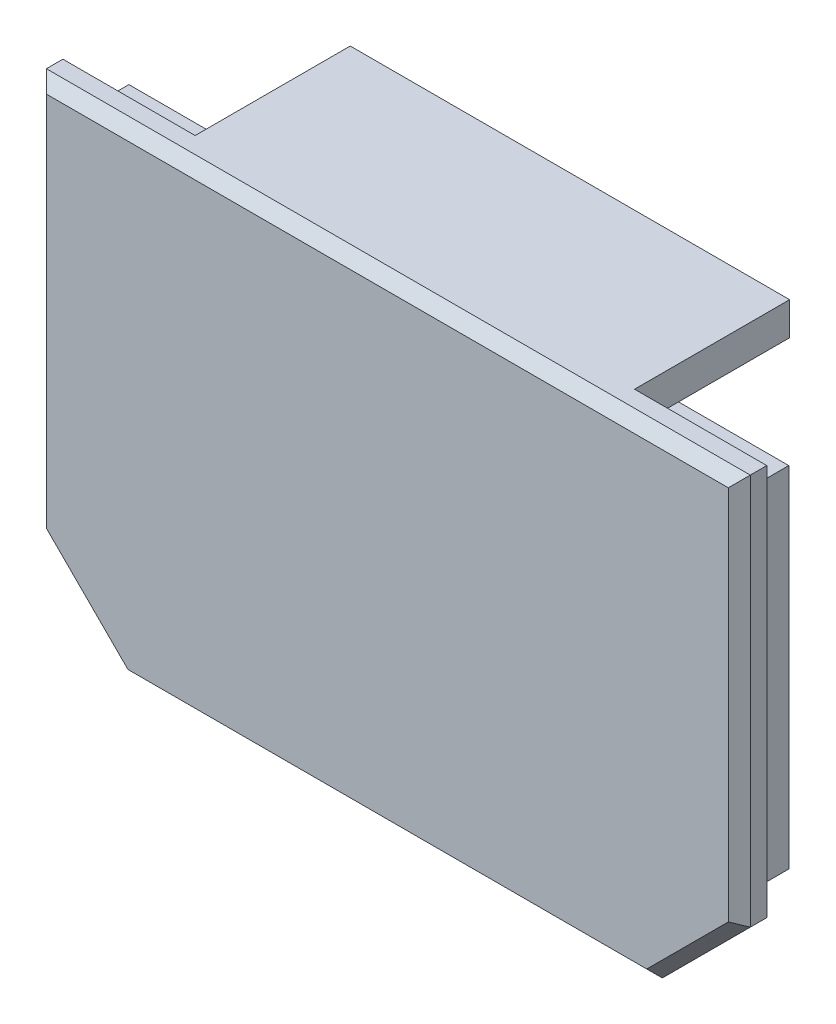
ISO-10303-21;
HEADER;
FILE_DESCRIPTION(('STEP AP214'),'2;1');
FILE_NAME('part.step','',(''),(''),'','','');
FILE_SCHEMA(('AUTOMOTIVE_DESIGN { 1 0 10303 214 1 1 1 1 }'));
ENDSEC;
DATA;
#1=APPLICATION_CONTEXT('core data for automotive mechanical design processes');
#2=APPLICATION_PROTOCOL_DEFINITION('international standard','automotive_design',2000,#1);
#3=PRODUCT_CONTEXT('',#1,'mechanical');
#4=PRODUCT('Part','Part','',(#3));
#5=PRODUCT_RELATED_PRODUCT_CATEGORY('part','',(#4));
#6=PRODUCT_DEFINITION_FORMATION('','',#4);
#7=PRODUCT_DEFINITION_CONTEXT('part definition',#1,'design');
#8=PRODUCT_DEFINITION('design','',#6,#7);
#9=PRODUCT_DEFINITION_SHAPE('','',#8);
#10=(LENGTH_UNIT() NAMED_UNIT(*) SI_UNIT(.MILLI.,.METRE.));
#11=(NAMED_UNIT(*) PLANE_ANGLE_UNIT() SI_UNIT($,.RADIAN.));
#12=(NAMED_UNIT(*) SI_UNIT($,.STERADIAN.) SOLID_ANGLE_UNIT());
#13=UNCERTAINTY_MEASURE_WITH_UNIT(LENGTH_MEASURE(1.E-05),#10,'distance_accuracy_value','');
#14=(GEOMETRIC_REPRESENTATION_CONTEXT(3) GLOBAL_UNCERTAINTY_ASSIGNED_CONTEXT((#13)) GLOBAL_UNIT_ASSIGNED_CONTEXT((#10,
#11,#12)) REPRESENTATION_CONTEXT('',''));
#15=CARTESIAN_POINT('',(0.,0.,0.));
#16=DIRECTION('',(0.,0.,1.));
#17=DIRECTION('',(1.,0.,0.));
#18=AXIS2_PLACEMENT_3D('',#15,#16,#17);
#19=CARTESIAN_POINT('',(-29.9999,-3.0001,-4.));
#20=DIRECTION('',(0.,1.,0.));
#21=DIRECTION('',(0.,0.,1.));
#22=AXIS2_PLACEMENT_3D('',#19,#20,#21);
#23=PLANE('',#22);
#24=DIRECTION('',(-1.,0.,0.));
#25=VECTOR('',#24,1.);
#26=CARTESIAN_POINT('',(-29.9999,-3.0001,-4.));
#27=LINE('',#26,#25);
#28=CARTESIAN_POINT('',(29.9999000000061,-3.0001,-4.));
#29=VERTEX_POINT('',#28);
#30=CARTESIAN_POINT('',(19.9750000000061,-3.0001,-4.));
#31=VERTEX_POINT('',#30);
#32=EDGE_CURVE('E389',#29,#31,#27,.T.);
#33=ORIENTED_EDGE('',*,*,#32,.T.);
#34=DIRECTION('',(0.,0.,1.));
#35=VECTOR('',#34,1.);
#36=CARTESIAN_POINT('',(19.9750000000061,-3.0001,-14.1));
#37=LINE('',#36,#35);
#38=CARTESIAN_POINT('',(19.9750000000061,-3.0001,0.));
#39=VERTEX_POINT('',#38);
#40=EDGE_CURVE('E271',#31,#39,#37,.T.);
#41=ORIENTED_EDGE('',*,*,#40,.T.);
#42=DIRECTION('',(-1.,0.,0.));
#43=VECTOR('',#42,1.);
#44=CARTESIAN_POINT('',(-29.9999,-3.0001,0.));
#45=LINE('',#44,#43);
#46=CARTESIAN_POINT('',(29.9999000000061,-3.0001,0.));
#47=VERTEX_POINT('',#46);
#48=EDGE_CURVE('E376',#47,#39,#45,.T.);
#49=ORIENTED_EDGE('',*,*,#48,.F.);
#50=DIRECTION('',(0.,0.,1.));
#51=VECTOR('',#50,1.);
#52=CARTESIAN_POINT('',(29.9999000000061,-3.0001,-4.));
#53=LINE('',#52,#51);
#54=EDGE_CURVE('E412',#29,#47,#53,.T.);
#55=ORIENTED_EDGE('',*,*,#54,.F.);
#56=EDGE_LOOP('',(#33,#41,#49,#55));
#57=FACE_BOUND('',#56,.T.);
#58=ADVANCED_FACE('F43',(#57),#23,.T.);
#59=CARTESIAN_POINT('',(-19.975,-3.0001,0.));
#60=VERTEX_POINT('',#59);
#61=CARTESIAN_POINT('',(-29.9999,-3.0001,0.));
#62=VERTEX_POINT('',#61);
#63=EDGE_CURVE('E405',#60,#62,#45,.T.);
#64=ORIENTED_EDGE('',*,*,#63,.F.);
#65=DIRECTION('',(0.,0.,1.));
#66=VECTOR('',#65,1.);
#67=CARTESIAN_POINT('',(-19.975,-3.0001,-14.1));
#68=LINE('',#67,#66);
#69=CARTESIAN_POINT('',(-19.975,-3.0001,-4.));
#70=VERTEX_POINT('',#69);
#71=EDGE_CURVE('E722',#70,#60,#68,.T.);
#72=ORIENTED_EDGE('',*,*,#71,.F.);
#73=CARTESIAN_POINT('',(-29.9999,-3.0001,-4.));
#74=VERTEX_POINT('',#73);
#75=EDGE_CURVE('E388',#70,#74,#27,.T.);
#76=ORIENTED_EDGE('',*,*,#75,.T.);
#77=DIRECTION('',(0.,0.,1.));
#78=VECTOR('',#77,1.);
#79=CARTESIAN_POINT('',(-29.9999,-3.0001,-4.));
#80=LINE('',#79,#78);
#81=EDGE_CURVE('E408',#74,#62,#80,.T.);
#82=ORIENTED_EDGE('',*,*,#81,.T.);
#83=EDGE_LOOP('',(#64,#72,#76,#82));
#84=FACE_BOUND('',#83,.T.);
#85=ADVANCED_FACE('F557',(#84),#23,.T.);
#86=CARTESIAN_POINT('',(0.,0.,0.));
#87=DIRECTION('',(0.,0.,-1.));
#88=DIRECTION('',(-1.,0.,0.));
#89=AXIS2_PLACEMENT_3D('',#86,#87,#88);
#90=PLANE('',#89);
#91=ORIENTED_EDGE('',*,*,#48,.T.);
#92=DIRECTION('',(0.,-1.,0.));
#93=VECTOR('',#92,1.);
#94=CARTESIAN_POINT('',(19.9750000000061,4.55020154334958E-12,0.));
#95=LINE('',#94,#93);
#96=CARTESIAN_POINT('',(19.9750000000061,4.55020154334958E-12,0.));
#97=VERTEX_POINT('',#96);
#98=EDGE_CURVE('E724',#97,#39,#95,.T.);
#99=ORIENTED_EDGE('',*,*,#98,.F.);
#100=DIRECTION('',(-1.,0.,0.));
#101=VECTOR('',#100,1.);
#102=CARTESIAN_POINT('',(-32.,0.,0.));
#103=LINE('',#102,#101);
#104=CARTESIAN_POINT('',(32.0000000000054,4.55020154334958E-12,0.));
#105=VERTEX_POINT('',#104);
#106=EDGE_CURVE('E300',#105,#97,#103,.T.);
#107=ORIENTED_EDGE('',*,*,#106,.F.);
#108=DIRECTION('',(0.,1.,0.));
#109=VECTOR('',#108,1.);
#110=CARTESIAN_POINT('',(32.0000000000054,4.55020154334958E-12,0.));
#111=LINE('',#110,#109);
#112=CARTESIAN_POINT('',(32.0000000000054,-35.6000000000053,0.));
#113=VERTEX_POINT('',#112);
#114=EDGE_CURVE('E296',#113,#105,#111,.T.);
#115=ORIENTED_EDGE('',*,*,#114,.F.);
#116=DIRECTION('',(0.707106781186548,0.707106781186547,0.));
#117=VECTOR('',#116,1.);
#118=CARTESIAN_POINT('',(32.0000000000054,-35.6000000000053,0.));
#119=LINE('',#118,#117);
#120=CARTESIAN_POINT('',(24.0000000000107,-43.6,0.));
#121=VERTEX_POINT('',#120);
#122=EDGE_CURVE('E293',#121,#113,#119,.T.);
#123=ORIENTED_EDGE('',*,*,#122,.F.);
#124=DIRECTION('',(1.,0.,0.));
#125=VECTOR('',#124,1.);
#126=CARTESIAN_POINT('',(24.0000000000107,-43.6,0.));
#127=LINE('',#126,#125);
#128=CARTESIAN_POINT('',(2.74999999999999,-43.6,0.));
#129=VERTEX_POINT('',#128);
#130=EDGE_CURVE('E291',#129,#121,#127,.T.);
#131=ORIENTED_EDGE('',*,*,#130,.F.);
#132=DIRECTION('',(0.,-1.,0.));
#133=VECTOR('',#132,1.);
#134=CARTESIAN_POINT('',(2.74999999999999,-35.4152415615735,0.));
#135=LINE('',#134,#133);
#136=CARTESIAN_POINT('',(2.74999999999999,-41.5999,0.));
#137=VERTEX_POINT('',#136);
#138=EDGE_CURVE('E474',#129,#137,#135,.F.);
#139=ORIENTED_EDGE('',*,*,#138,.T.);
#140=DIRECTION('',(1.,0.,0.));
#141=VECTOR('',#140,1.);
#142=CARTESIAN_POINT('',(23.171531453909,-41.5999,0.));
#143=LINE('',#142,#141);
#144=CARTESIAN_POINT('',(23.171531453909,-41.5999,0.));
#145=VERTEX_POINT('',#144);
#146=EDGE_CURVE('E397',#137,#145,#143,.T.);
#147=ORIENTED_EDGE('',*,*,#146,.T.);
#148=DIRECTION('',(0.707106781186547,0.707106781186548,0.));
#149=VECTOR('',#148,1.);
#150=CARTESIAN_POINT('',(29.9999000000061,-34.7715314539029,0.));
#151=LINE('',#150,#149);
#152=CARTESIAN_POINT('',(29.9999000000061,-34.7715314539029,0.));
#153=VERTEX_POINT('',#152);
#154=EDGE_CURVE('E399',#145,#153,#151,.T.);
#155=ORIENTED_EDGE('',*,*,#154,.T.);
#156=DIRECTION('',(0.,1.,0.));
#157=VECTOR('',#156,1.);
#158=CARTESIAN_POINT('',(29.9999000000061,-3.0001,0.));
#159=LINE('',#158,#157);
#160=EDGE_CURVE('E402',#153,#47,#159,.T.);
#161=ORIENTED_EDGE('',*,*,#160,.T.);
#162=EDGE_LOOP('',(#91,#99,#107,#115,#123,#131,#139,#147,#155,#161));
#163=FACE_BOUND('',#162,.T.);
#164=ADVANCED_FACE('F502',(#163),#90,.T.);
#165=CARTESIAN_POINT('',(-19.975,8.54940211855845E-13,0.));
#166=VERTEX_POINT('',#165);
#167=CARTESIAN_POINT('',(-32.,0.,0.));
#168=VERTEX_POINT('',#167);
#169=EDGE_CURVE('E299',#166,#168,#103,.T.);
#170=ORIENTED_EDGE('',*,*,#169,.F.);
#171=DIRECTION('',(0.,1.,0.));
#172=VECTOR('',#171,1.);
#173=CARTESIAN_POINT('',(-19.975,4.55020154334958E-12,0.));
#174=LINE('',#173,#172);
#175=EDGE_CURVE('E267',#60,#166,#174,.T.);
#176=ORIENTED_EDGE('',*,*,#175,.F.);
#177=ORIENTED_EDGE('',*,*,#63,.T.);
#178=DIRECTION('',(0.,-1.,0.));
#179=VECTOR('',#178,1.);
#180=CARTESIAN_POINT('',(-29.9999,-34.7715314538976,0.));
#181=LINE('',#180,#179);
#182=CARTESIAN_POINT('',(-29.9999,-34.7715314538976,0.));
#183=VERTEX_POINT('',#182);
#184=EDGE_CURVE('E357',#62,#183,#181,.T.);
#185=ORIENTED_EDGE('',*,*,#184,.T.);
#186=DIRECTION('',(0.707106781186548,-0.707106781186547,0.));
#187=VECTOR('',#186,1.);
#188=CARTESIAN_POINT('',(-23.1715314538976,-41.5999,0.));
#189=LINE('',#188,#187);
#190=CARTESIAN_POINT('',(-23.1715314538976,-41.5999,0.));
#191=VERTEX_POINT('',#190);
#192=EDGE_CURVE('E395',#183,#191,#189,.T.);
#193=ORIENTED_EDGE('',*,*,#192,.T.);
#194=CARTESIAN_POINT('',(-2.74999999999998,-41.5999,0.));
#195=VERTEX_POINT('',#194);
#196=EDGE_CURVE('E80',#191,#195,#143,.T.);
#197=ORIENTED_EDGE('',*,*,#196,.T.);
#198=DIRECTION('',(0.,1.,0.));
#199=VECTOR('',#198,1.);
#200=CARTESIAN_POINT('',(-2.74999999999998,-35.4152415615735,0.));
#201=LINE('',#200,#199);
#202=CARTESIAN_POINT('',(-2.74999999999998,-43.6,0.));
#203=VERTEX_POINT('',#202);
#204=EDGE_CURVE('E52',#195,#203,#201,.F.);
#205=ORIENTED_EDGE('',*,*,#204,.T.);
#206=CARTESIAN_POINT('',(-24.,-43.6,0.));
#207=VERTEX_POINT('',#206);
#208=EDGE_CURVE('E67',#207,#203,#127,.T.);
#209=ORIENTED_EDGE('',*,*,#208,.F.);
#210=DIRECTION('',(0.707106781186549,-0.707106781186547,0.));
#211=VECTOR('',#210,1.);
#212=CARTESIAN_POINT('',(-24.,-43.6,0.));
#213=LINE('',#212,#211);
#214=CARTESIAN_POINT('',(-32.,-35.6,0.));
#215=VERTEX_POINT('',#214);
#216=EDGE_CURVE('E287',#215,#207,#213,.T.);
#217=ORIENTED_EDGE('',*,*,#216,.F.);
#218=DIRECTION('',(0.,-1.,0.));
#219=VECTOR('',#218,1.);
#220=CARTESIAN_POINT('',(-32.,-35.6,0.));
#221=LINE('',#220,#219);
#222=EDGE_CURVE('E284',#168,#215,#221,.T.);
#223=ORIENTED_EDGE('',*,*,#222,.F.);
#224=EDGE_LOOP('',(#170,#176,#177,#185,#193,#197,#205,#209,#217,#223));
#225=FACE_BOUND('',#224,.T.);
#226=ADVANCED_FACE('F478',(#225),#90,.T.);
#227=CARTESIAN_POINT('',(-29.9999,-34.7715314538976,-4.));
#228=DIRECTION('',(-1.,0.,0.));
#229=DIRECTION('',(0.,0.,1.));
#230=AXIS2_PLACEMENT_3D('',#227,#228,#229);
#231=PLANE('',#230);
#232=ORIENTED_EDGE('',*,*,#184,.F.);
#233=ORIENTED_EDGE('',*,*,#81,.F.);
#234=DIRECTION('',(0.,-1.,0.));
#235=VECTOR('',#234,1.);
#236=CARTESIAN_POINT('',(-29.9999,-34.7715314538976,-4.));
#237=LINE('',#236,#235);
#238=CARTESIAN_POINT('',(-29.9999,-34.7715314538976,-4.));
#239=VERTEX_POINT('',#238);
#240=EDGE_CURVE('E372',#74,#239,#237,.T.);
#241=ORIENTED_EDGE('',*,*,#240,.T.);
#242=DIRECTION('',(0.,0.,1.));
#243=VECTOR('',#242,1.);
#244=CARTESIAN_POINT('',(-29.9999,-34.7715314538976,-4.));
#245=LINE('',#244,#243);
#246=EDGE_CURVE('E392',#239,#183,#245,.T.);
#247=ORIENTED_EDGE('',*,*,#246,.T.);
#248=EDGE_LOOP('',(#232,#233,#241,#247));
#249=FACE_BOUND('',#248,.T.);
#250=ADVANCED_FACE('F573',(#249),#231,.T.);
#251=CARTESIAN_POINT('',(29.9999000000061,-3.0001,-4.));
#252=DIRECTION('',(1.,0.,0.));
#253=DIRECTION('',(0.,1.,0.));
#254=AXIS2_PLACEMENT_3D('',#251,#252,#253);
#255=PLANE('',#254);
#256=ORIENTED_EDGE('',*,*,#160,.F.);
#257=DIRECTION('',(0.,0.,1.));
#258=VECTOR('',#257,1.);
#259=CARTESIAN_POINT('',(29.9999000000061,-34.7715314539029,-4.));
#260=LINE('',#259,#258);
#261=CARTESIAN_POINT('',(29.9999000000061,-34.7715314539029,-4.));
#262=VERTEX_POINT('',#261);
#263=EDGE_CURVE('E414',#262,#153,#260,.T.);
#264=ORIENTED_EDGE('',*,*,#263,.F.);
#265=DIRECTION('',(0.,1.,0.));
#266=VECTOR('',#265,1.);
#267=CARTESIAN_POINT('',(29.9999000000061,-3.0001,-4.));
#268=LINE('',#267,#266);
#269=EDGE_CURVE('E385',#262,#29,#268,.T.);
#270=ORIENTED_EDGE('',*,*,#269,.T.);
#271=ORIENTED_EDGE('',*,*,#54,.T.);
#272=EDGE_LOOP('',(#256,#264,#270,#271));
#273=FACE_BOUND('',#272,.T.);
#274=ADVANCED_FACE('F569',(#273),#255,.T.);
#275=CARTESIAN_POINT('',(29.9999000000061,-34.7715314539029,-4.));
#276=DIRECTION('',(0.707106781186548,-0.707106781186547,0.));
#277=DIRECTION('',(0.707106781186547,0.707106781186548,0.));
#278=AXIS2_PLACEMENT_3D('',#275,#276,#277);
#279=PLANE('',#278);
#280=ORIENTED_EDGE('',*,*,#154,.F.);
#281=DIRECTION('',(0.,0.,1.));
#282=VECTOR('',#281,1.);
#283=CARTESIAN_POINT('',(23.171531453909,-41.5999,-4.));
#284=LINE('',#283,#282);
#285=CARTESIAN_POINT('',(23.171531453909,-41.5999,-4.));
#286=VERTEX_POINT('',#285);
#287=EDGE_CURVE('E416',#286,#145,#284,.T.);
#288=ORIENTED_EDGE('',*,*,#287,.F.);
#289=DIRECTION('',(0.707106781186547,0.707106781186548,0.));
#290=VECTOR('',#289,1.);
#291=CARTESIAN_POINT('',(29.9999000000061,-34.7715314539029,-4.));
#292=LINE('',#291,#290);
#293=EDGE_CURVE('E382',#286,#262,#292,.T.);
#294=ORIENTED_EDGE('',*,*,#293,.T.);
#295=ORIENTED_EDGE('',*,*,#263,.T.);
#296=EDGE_LOOP('',(#280,#288,#294,#295));
#297=FACE_BOUND('',#296,.T.);
#298=ADVANCED_FACE('F572',(#297),#279,.T.);
#299=CARTESIAN_POINT('',(23.171531453909,-41.5999,-4.));
#300=DIRECTION('',(0.,-1.,0.));
#301=DIRECTION('',(1.,0.,0.));
#302=AXIS2_PLACEMENT_3D('',#299,#300,#301);
#303=PLANE('',#302);
#304=ORIENTED_EDGE('',*,*,#146,.F.);
#305=DIRECTION('',(0.707106781186551,0.,-0.707106781186544));
#306=VECTOR('',#305,1.);
#307=CARTESIAN_POINT('',(14.9607657269546,-41.5999,-12.2107657269545));
#308=LINE('',#307,#306);
#309=CARTESIAN_POINT('',(1.99999999999998,-41.5999,0.75));
#310=VERTEX_POINT('',#309);
#311=EDGE_CURVE('E469',#137,#310,#308,.F.);
#312=ORIENTED_EDGE('',*,*,#311,.T.);
#313=DIRECTION('',(1.,0.,0.));
#314=VECTOR('',#313,1.);
#315=CARTESIAN_POINT('',(-3.,-41.5999,0.75));
#316=LINE('',#315,#314);
#317=CARTESIAN_POINT('',(-1.99999999999999,-41.5999,0.75));
#318=VERTEX_POINT('',#317);
#319=EDGE_CURVE('E280',#318,#310,#316,.T.);
#320=ORIENTED_EDGE('',*,*,#319,.F.);
#321=DIRECTION('',(0.707106781186544,0.,0.707106781186551));
#322=VECTOR('',#321,1.);
#323=CARTESIAN_POINT('',(8.21076572695439,-41.5999,10.9607657269545));
#324=LINE('',#323,#322);
#325=EDGE_CURVE('E467',#318,#195,#324,.F.);
#326=ORIENTED_EDGE('',*,*,#325,.T.);
#327=ORIENTED_EDGE('',*,*,#196,.F.);
#328=DIRECTION('',(0.,0.,1.));
#329=VECTOR('',#328,1.);
#330=CARTESIAN_POINT('',(-23.1715314538976,-41.5999,-4.));
#331=LINE('',#330,#329);
#332=CARTESIAN_POINT('',(-23.1715314538976,-41.5999,-4.));
#333=VERTEX_POINT('',#332);
#334=EDGE_CURVE('E419',#333,#191,#331,.T.);
#335=ORIENTED_EDGE('',*,*,#334,.F.);
#336=DIRECTION('',(1.,0.,0.));
#337=VECTOR('',#336,1.);
#338=CARTESIAN_POINT('',(23.171531453909,-41.5999,-4.));
#339=LINE('',#338,#337);
#340=EDGE_CURVE('E379',#333,#286,#339,.T.);
#341=ORIENTED_EDGE('',*,*,#340,.T.);
#342=ORIENTED_EDGE('',*,*,#287,.T.);
#343=EDGE_LOOP('',(#304,#312,#320,#326,#327,#335,#341,#342));
#344=FACE_BOUND('',#343,.T.);
#345=ADVANCED_FACE('F487',(#344),#303,.T.);
#346=CARTESIAN_POINT('',(-23.1715314538976,-41.5999,-4.));
#347=DIRECTION('',(-0.707106781186547,-0.707106781186548,0.));
#348=DIRECTION('',(0.707106781186548,-0.707106781186547,0.));
#349=AXIS2_PLACEMENT_3D('',#346,#347,#348);
#350=PLANE('',#349);
#351=ORIENTED_EDGE('',*,*,#192,.F.);
#352=ORIENTED_EDGE('',*,*,#246,.F.);
#353=DIRECTION('',(0.707106781186548,-0.707106781186547,0.));
#354=VECTOR('',#353,1.);
#355=CARTESIAN_POINT('',(-23.1715314538976,-41.5999,-4.));
#356=LINE('',#355,#354);
#357=EDGE_CURVE('E375',#239,#333,#356,.T.);
#358=ORIENTED_EDGE('',*,*,#357,.T.);
#359=ORIENTED_EDGE('',*,*,#334,.T.);
#360=EDGE_LOOP('',(#351,#352,#358,#359));
#361=FACE_BOUND('',#360,.T.);
#362=ADVANCED_FACE('F580',(#361),#350,.T.);
#363=CARTESIAN_POINT('',(0.,0.,-4.));
#364=DIRECTION('',(0.,0.,-1.));
#365=DIRECTION('',(-1.,0.,0.));
#366=AXIS2_PLACEMENT_3D('',#363,#364,#365);
#367=PLANE('',#366);
#368=DIRECTION('',(0.707106781186548,-0.707106781186548,0.));
#369=VECTOR('',#368,1.);
#370=CARTESIAN_POINT('',(-22.3431457505076,-39.6,-4.));
#371=LINE('',#370,#369);
#372=CARTESIAN_POINT('',(-28.,-33.9431457505076,-4.));
#373=VERTEX_POINT('',#372);
#374=CARTESIAN_POINT('',(-22.3431457505076,-39.6,-4.));
#375=VERTEX_POINT('',#374);
#376=EDGE_CURVE('E318',#373,#375,#371,.T.);
#377=ORIENTED_EDGE('',*,*,#376,.T.);
#378=DIRECTION('',(1.,0.,0.));
#379=VECTOR('',#378,1.);
#380=CARTESIAN_POINT('',(22.3431457505191,-39.6,-4.));
#381=LINE('',#380,#379);
#382=CARTESIAN_POINT('',(22.3431457505191,-39.6,-4.));
#383=VERTEX_POINT('',#382);
#384=EDGE_CURVE('E321',#375,#383,#381,.T.);
#385=ORIENTED_EDGE('',*,*,#384,.T.);
#386=DIRECTION('',(0.707106781186547,0.707106781186547,0.));
#387=VECTOR('',#386,1.);
#388=CARTESIAN_POINT('',(28.0000000000061,-33.9431457505129,-4.));
#389=LINE('',#388,#387);
#390=CARTESIAN_POINT('',(28.0000000000061,-33.9431457505129,-4.));
#391=VERTEX_POINT('',#390);
#392=EDGE_CURVE('E325',#383,#391,#389,.T.);
#393=ORIENTED_EDGE('',*,*,#392,.T.);
#394=DIRECTION('',(0.,1.,0.));
#395=VECTOR('',#394,1.);
#396=CARTESIAN_POINT('',(28.0000000000061,-5.,-4.));
#397=LINE('',#396,#395);
#398=CARTESIAN_POINT('',(28.0000000000061,-5.,-4.));
#399=VERTEX_POINT('',#398);
#400=EDGE_CURVE('E328',#391,#399,#397,.T.);
#401=ORIENTED_EDGE('',*,*,#400,.T.);
#402=DIRECTION('',(-1.,0.,0.));
#403=VECTOR('',#402,1.);
#404=CARTESIAN_POINT('',(-28.,-5.,-4.));
#405=LINE('',#404,#403);
#406=CARTESIAN_POINT('',(-28.,-5.,-4.));
#407=VERTEX_POINT('',#406);
#408=EDGE_CURVE('E331',#399,#407,#405,.T.);
#409=ORIENTED_EDGE('',*,*,#408,.T.);
#410=DIRECTION('',(0.,-1.,0.));
#411=VECTOR('',#410,1.);
#412=CARTESIAN_POINT('',(-28.,-33.9431457505076,-4.));
#413=LINE('',#412,#411);
#414=EDGE_CURVE('E334',#407,#373,#413,.T.);
#415=ORIENTED_EDGE('',*,*,#414,.T.);
#416=EDGE_LOOP('',(#377,#385,#393,#401,#409,#415));
#417=FACE_BOUND('',#416,.T.);
#418=ORIENTED_EDGE('',*,*,#240,.F.);
#419=ORIENTED_EDGE('',*,*,#75,.F.);
#420=DIRECTION('',(1.,0.,0.));
#421=VECTOR('',#420,1.);
#422=CARTESIAN_POINT('',(0.,-3.0001,-4.));
#423=LINE('',#422,#421);
#424=EDGE_CURVE('E272',#70,#31,#423,.T.);
#425=ORIENTED_EDGE('',*,*,#424,.T.);
#426=ORIENTED_EDGE('',*,*,#32,.F.);
#427=ORIENTED_EDGE('',*,*,#269,.F.);
#428=ORIENTED_EDGE('',*,*,#293,.F.);
#429=ORIENTED_EDGE('',*,*,#340,.F.);
#430=ORIENTED_EDGE('',*,*,#357,.F.);
#431=EDGE_LOOP('',(#418,#419,#425,#426,#427,#428,#429,#430));
#432=FACE_BOUND('',#431,.T.);
#433=ADVANCED_FACE('F567',(#417,#432),#367,.T.);
#434=CARTESIAN_POINT('',(-22.3431457505076,-39.6,-4.));
#435=DIRECTION('',(-0.707106781186547,-0.707106781186547,0.));
#436=DIRECTION('',(0.707106781186548,-0.707106781186548,0.));
#437=AXIS2_PLACEMENT_3D('',#434,#435,#436);
#438=PLANE('',#437);
#439=DIRECTION('',(0.707106781186548,-0.707106781186548,0.));
#440=VECTOR('',#439,1.);
#441=CARTESIAN_POINT('',(-22.3431457505076,-39.6,0.));
#442=LINE('',#441,#440);
#443=CARTESIAN_POINT('',(-28.,-33.9431457505076,0.));
#444=VERTEX_POINT('',#443);
#445=CARTESIAN_POINT('',(-22.3431457505076,-39.6,0.));
#446=VERTEX_POINT('',#445);
#447=EDGE_CURVE('E317',#444,#446,#442,.T.);
#448=ORIENTED_EDGE('',*,*,#447,.T.);
#449=DIRECTION('',(0.,0.,1.));
#450=VECTOR('',#449,1.);
#451=CARTESIAN_POINT('',(-22.3431457505076,-39.6,-4.));
#452=LINE('',#451,#450);
#453=EDGE_CURVE('E337',#375,#446,#452,.T.);
#454=ORIENTED_EDGE('',*,*,#453,.F.);
#455=ORIENTED_EDGE('',*,*,#376,.F.);
#456=DIRECTION('',(0.,0.,1.));
#457=VECTOR('',#456,1.);
#458=CARTESIAN_POINT('',(-28.,-33.9431457505076,-4.));
#459=LINE('',#458,#457);
#460=EDGE_CURVE('E354',#373,#444,#459,.T.);
#461=ORIENTED_EDGE('',*,*,#460,.T.);
#462=EDGE_LOOP('',(#448,#454,#455,#461));
#463=FACE_BOUND('',#462,.T.);
#464=ADVANCED_FACE('F646',(#463),#438,.F.);
#465=CARTESIAN_POINT('',(-28.,-33.9431457505076,-4.));
#466=DIRECTION('',(-1.,0.,0.));
#467=DIRECTION('',(0.,0.,1.));
#468=AXIS2_PLACEMENT_3D('',#465,#466,#467);
#469=PLANE('',#468);
#470=DIRECTION('',(0.,-1.,0.));
#471=VECTOR('',#470,1.);
#472=CARTESIAN_POINT('',(-28.,-33.9431457505076,0.));
#473=LINE('',#472,#471);
#474=CARTESIAN_POINT('',(-28.,-5.,0.));
#475=VERTEX_POINT('',#474);
#476=EDGE_CURVE('E322',#475,#444,#473,.T.);
#477=ORIENTED_EDGE('',*,*,#476,.T.);
#478=ORIENTED_EDGE('',*,*,#460,.F.);
#479=ORIENTED_EDGE('',*,*,#414,.F.);
#480=DIRECTION('',(0.,0.,1.));
#481=VECTOR('',#480,1.);
#482=CARTESIAN_POINT('',(-28.,-5.,-4.));
#483=LINE('',#482,#481);
#484=EDGE_CURVE('E358',#407,#475,#483,.T.);
#485=ORIENTED_EDGE('',*,*,#484,.T.);
#486=EDGE_LOOP('',(#477,#478,#479,#485));
#487=FACE_BOUND('',#486,.T.);
#488=ADVANCED_FACE('F642',(#487),#469,.F.);
#489=CARTESIAN_POINT('',(-28.,-5.,-4.));
#490=DIRECTION('',(0.,1.,0.));
#491=DIRECTION('',(0.,0.,1.));
#492=AXIS2_PLACEMENT_3D('',#489,#490,#491);
#493=PLANE('',#492);
#494=DIRECTION('',(-1.,0.,0.));
#495=VECTOR('',#494,1.);
#496=CARTESIAN_POINT('',(-28.,-5.,0.));
#497=LINE('',#496,#495);
#498=CARTESIAN_POINT('',(28.0000000000061,-5.,0.));
#499=VERTEX_POINT('',#498);
#500=EDGE_CURVE('E349',#499,#475,#497,.T.);
#501=ORIENTED_EDGE('',*,*,#500,.T.);
#502=ORIENTED_EDGE('',*,*,#484,.F.);
#503=ORIENTED_EDGE('',*,*,#408,.F.);
#504=DIRECTION('',(0.,0.,1.));
#505=VECTOR('',#504,1.);
#506=CARTESIAN_POINT('',(28.0000000000061,-5.,-4.));
#507=LINE('',#506,#505);
#508=EDGE_CURVE('E361',#399,#499,#507,.T.);
#509=ORIENTED_EDGE('',*,*,#508,.T.);
#510=EDGE_LOOP('',(#501,#502,#503,#509));
#511=FACE_BOUND('',#510,.T.);
#512=ADVANCED_FACE('F645',(#511),#493,.F.);
#513=CARTESIAN_POINT('',(28.0000000000061,-5.,-4.));
#514=DIRECTION('',(1.,0.,0.));
#515=DIRECTION('',(0.,0.,-1.));
#516=AXIS2_PLACEMENT_3D('',#513,#514,#515);
#517=PLANE('',#516);
#518=DIRECTION('',(0.,1.,0.));
#519=VECTOR('',#518,1.);
#520=CARTESIAN_POINT('',(28.0000000000061,-5.,0.));
#521=LINE('',#520,#519);
#522=CARTESIAN_POINT('',(28.0000000000061,-33.9431457505129,0.));
#523=VERTEX_POINT('',#522);
#524=EDGE_CURVE('E346',#523,#499,#521,.T.);
#525=ORIENTED_EDGE('',*,*,#524,.T.);
#526=ORIENTED_EDGE('',*,*,#508,.F.);
#527=ORIENTED_EDGE('',*,*,#400,.F.);
#528=DIRECTION('',(0.,0.,1.));
#529=VECTOR('',#528,1.);
#530=CARTESIAN_POINT('',(28.0000000000061,-33.9431457505129,-4.));
#531=LINE('',#530,#529);
#532=EDGE_CURVE('E364',#391,#523,#531,.T.);
#533=ORIENTED_EDGE('',*,*,#532,.T.);
#534=EDGE_LOOP('',(#525,#526,#527,#533));
#535=FACE_BOUND('',#534,.T.);
#536=ADVANCED_FACE('F650',(#535),#517,.F.);
#537=CARTESIAN_POINT('',(28.0000000000061,-33.9431457505129,-4.));
#538=DIRECTION('',(0.707106781186547,-0.707106781186547,0.));
#539=DIRECTION('',(0.707106781186548,0.707106781186548,0.));
#540=AXIS2_PLACEMENT_3D('',#537,#538,#539);
#541=PLANE('',#540);
#542=DIRECTION('',(0.707106781186547,0.707106781186547,0.));
#543=VECTOR('',#542,1.);
#544=CARTESIAN_POINT('',(28.0000000000061,-33.9431457505129,0.));
#545=LINE('',#544,#543);
#546=CARTESIAN_POINT('',(22.3431457505191,-39.6,0.));
#547=VERTEX_POINT('',#546);
#548=EDGE_CURVE('E343',#547,#523,#545,.T.);
#549=ORIENTED_EDGE('',*,*,#548,.T.);
#550=ORIENTED_EDGE('',*,*,#532,.F.);
#551=ORIENTED_EDGE('',*,*,#392,.F.);
#552=DIRECTION('',(0.,0.,1.));
#553=VECTOR('',#552,1.);
#554=CARTESIAN_POINT('',(22.3431457505191,-39.6,-4.));
#555=LINE('',#554,#553);
#556=EDGE_CURVE('E367',#383,#547,#555,.T.);
#557=ORIENTED_EDGE('',*,*,#556,.T.);
#558=EDGE_LOOP('',(#549,#550,#551,#557));
#559=FACE_BOUND('',#558,.T.);
#560=ADVANCED_FACE('F654',(#559),#541,.F.);
#561=CARTESIAN_POINT('',(22.3431457505191,-39.6,-4.));
#562=DIRECTION('',(0.,-1.,0.));
#563=DIRECTION('',(0.,0.,-1.));
#564=AXIS2_PLACEMENT_3D('',#561,#562,#563);
#565=PLANE('',#564);
#566=DIRECTION('',(1.,0.,0.));
#567=VECTOR('',#566,1.);
#568=CARTESIAN_POINT('',(22.3431457505191,-39.6,0.));
#569=LINE('',#568,#567);
#570=EDGE_CURVE('E340',#446,#547,#569,.T.);
#571=ORIENTED_EDGE('',*,*,#570,.T.);
#572=ORIENTED_EDGE('',*,*,#556,.F.);
#573=ORIENTED_EDGE('',*,*,#384,.F.);
#574=ORIENTED_EDGE('',*,*,#453,.T.);
#575=EDGE_LOOP('',(#571,#572,#573,#574));
#576=FACE_BOUND('',#575,.T.);
#577=ADVANCED_FACE('F628',(#576),#565,.F.);
#578=CARTESIAN_POINT('',(0.,0.,2.5));
#579=DIRECTION('',(0.,0.,-1.));
#580=DIRECTION('',(-1.,0.,0.));
#581=AXIS2_PLACEMENT_3D('',#578,#579,#580);
#582=PLANE('',#581);
#583=DIRECTION('',(0.,1.,0.));
#584=VECTOR('',#583,1.);
#585=CARTESIAN_POINT('',(31.0000000000054,0.,2.5));
#586=LINE('',#585,#584);
#587=CARTESIAN_POINT('',(31.0000000000054,-35.1857864376322,2.5));
#588=VERTEX_POINT('',#587);
#589=CARTESIAN_POINT('',(31.0000000000054,-0.999999999995522,2.5));
#590=VERTEX_POINT('',#589);
#591=EDGE_CURVE('E429',#588,#590,#586,.T.);
#592=ORIENTED_EDGE('',*,*,#591,.T.);
#593=DIRECTION('',(-1.,0.,0.));
#594=VECTOR('',#593,1.);
#595=CARTESIAN_POINT('',(0.,-0.999999999997726,2.5));
#596=LINE('',#595,#594);
#597=CARTESIAN_POINT('',(-31.,-0.99999999999993,2.5));
#598=VERTEX_POINT('',#597);
#599=EDGE_CURVE('E431',#590,#598,#596,.T.);
#600=ORIENTED_EDGE('',*,*,#599,.T.);
#601=DIRECTION('',(0.,-1.,0.));
#602=VECTOR('',#601,1.);
#603=CARTESIAN_POINT('',(-31.,0.,2.5));
#604=LINE('',#603,#602);
#605=CARTESIAN_POINT('',(-31.,-35.1857864376269,2.5));
#606=VERTEX_POINT('',#605);
#607=EDGE_CURVE('E411',#598,#606,#604,.T.);
#608=ORIENTED_EDGE('',*,*,#607,.T.);
#609=DIRECTION('',(0.707106781186548,-0.707106781186547,0.));
#610=VECTOR('',#609,1.);
#611=CARTESIAN_POINT('',(-33.0928932188134,-33.0928932188135,2.5));
#612=LINE('',#611,#610);
#613=CARTESIAN_POINT('',(-23.5857864376269,-42.6,2.5));
#614=VERTEX_POINT('',#613);
#615=EDGE_CURVE('E423',#606,#614,#612,.T.);
#616=ORIENTED_EDGE('',*,*,#615,.T.);
#617=DIRECTION('',(1.,0.,0.));
#618=VECTOR('',#617,1.);
#619=CARTESIAN_POINT('',(0.,-42.6,2.5));
#620=LINE('',#619,#618);
#621=CARTESIAN_POINT('',(23.5857864376376,-42.6,2.5));
#622=VERTEX_POINT('',#621);
#623=EDGE_CURVE('E425',#614,#622,#620,.T.);
#624=ORIENTED_EDGE('',*,*,#623,.T.);
#625=DIRECTION('',(0.707106781186548,0.707106781186547,0.));
#626=VECTOR('',#625,1.);
#627=CARTESIAN_POINT('',(33.0928932188188,-33.0928932188188,2.5));
#628=LINE('',#627,#626);
#629=EDGE_CURVE('E427',#622,#588,#628,.T.);
#630=ORIENTED_EDGE('',*,*,#629,.T.);
#631=EDGE_LOOP('',(#592,#600,#608,#616,#624,#630));
#632=FACE_BOUND('',#631,.T.);
#633=ADVANCED_FACE('F520',(#632),#582,.F.);
#634=CARTESIAN_POINT('',(-32.,0.,2.5));
#635=DIRECTION('',(0.,-1.,0.));
#636=DIRECTION('',(1.,0.,0.));
#637=AXIS2_PLACEMENT_3D('',#634,#635,#636);
#638=PLANE('',#637);
#639=DIRECTION('',(0.,0.,-1.));
#640=VECTOR('',#639,1.);
#641=CARTESIAN_POINT('',(-32.,0.,2.5));
#642=LINE('',#641,#640);
#643=CARTESIAN_POINT('',(-32.,0.,1.49999999999999));
#644=VERTEX_POINT('',#643);
#645=EDGE_CURVE('E303',#644,#168,#642,.T.);
#646=ORIENTED_EDGE('',*,*,#645,.F.);
#647=DIRECTION('',(1.,0.,0.));
#648=VECTOR('',#647,1.);
#649=CARTESIAN_POINT('',(-32.,0.,1.49999999999999));
#650=LINE('',#649,#648);
#651=CARTESIAN_POINT('',(32.0000000000054,4.55020154334958E-12,1.49999999999999));
#652=VERTEX_POINT('',#651);
#653=EDGE_CURVE('E434',#644,#652,#650,.T.);
#654=ORIENTED_EDGE('',*,*,#653,.T.);
#655=DIRECTION('',(0.,0.,-1.));
#656=VECTOR('',#655,1.);
#657=CARTESIAN_POINT('',(32.0000000000054,4.55020154334958E-12,2.5));
#658=LINE('',#657,#656);
#659=EDGE_CURVE('E306',#652,#105,#658,.T.);
#660=ORIENTED_EDGE('',*,*,#659,.T.);
#661=ORIENTED_EDGE('',*,*,#106,.T.);
#662=DIRECTION('',(0.,0.,1.));
#663=VECTOR('',#662,1.);
#664=CARTESIAN_POINT('',(19.9750000000061,4.55020154334958E-12,-14.1));
#665=LINE('',#664,#663);
#666=CARTESIAN_POINT('',(19.9750000000061,4.55020154334958E-12,-14.1));
#667=VERTEX_POINT('',#666);
#668=EDGE_CURVE('E729',#667,#97,#665,.T.);
#669=ORIENTED_EDGE('',*,*,#668,.F.);
#670=DIRECTION('',(1.,0.,0.));
#671=VECTOR('',#670,1.);
#672=CARTESIAN_POINT('',(19.9750000000061,4.55020154334958E-12,-14.1));
#673=LINE('',#672,#671);
#674=CARTESIAN_POINT('',(-19.975,4.55020154334958E-12,-14.1));
#675=VERTEX_POINT('',#674);
#676=EDGE_CURVE('E264',#675,#667,#673,.T.);
#677=ORIENTED_EDGE('',*,*,#676,.F.);
#678=DIRECTION('',(0.,0.,1.));
#679=VECTOR('',#678,1.);
#680=CARTESIAN_POINT('',(-19.975,4.55020154334958E-12,-14.1));
#681=LINE('',#680,#679);
#682=EDGE_CURVE('E59',#675,#166,#681,.T.);
#683=ORIENTED_EDGE('',*,*,#682,.T.);
#684=ORIENTED_EDGE('',*,*,#169,.T.);
#685=EDGE_LOOP('',(#646,#654,#660,#661,#669,#677,#683,#684));
#686=FACE_BOUND('',#685,.T.);
#687=ADVANCED_FACE('F538',(#686),#638,.F.);
#688=CARTESIAN_POINT('',(32.0000000000054,4.55020154334958E-12,2.5));
#689=DIRECTION('',(-1.,0.,0.));
#690=DIRECTION('',(0.,0.,1.));
#691=AXIS2_PLACEMENT_3D('',#688,#689,#690);
#692=PLANE('',#691);
#693=ORIENTED_EDGE('',*,*,#659,.F.);
#694=DIRECTION('',(0.,-1.,0.));
#695=VECTOR('',#694,1.);
#696=CARTESIAN_POINT('',(32.0000000000054,4.55020154334958E-12,1.49999999999999));
#697=LINE('',#696,#695);
#698=CARTESIAN_POINT('',(32.0000000000054,-35.6000000000053,1.49999999999999));
#699=VERTEX_POINT('',#698);
#700=EDGE_CURVE('E437',#652,#699,#697,.T.);
#701=ORIENTED_EDGE('',*,*,#700,.T.);
#702=DIRECTION('',(0.,0.,-1.));
#703=VECTOR('',#702,1.);
#704=CARTESIAN_POINT('',(32.0000000000054,-35.6000000000053,2.5));
#705=LINE('',#704,#703);
#706=EDGE_CURVE('E308',#699,#113,#705,.T.);
#707=ORIENTED_EDGE('',*,*,#706,.T.);
#708=ORIENTED_EDGE('',*,*,#114,.T.);
#709=EDGE_LOOP('',(#693,#701,#707,#708));
#710=FACE_BOUND('',#709,.T.);
#711=ADVANCED_FACE('F507',(#710),#692,.F.);
#712=CARTESIAN_POINT('',(32.0000000000054,-35.6000000000053,2.5));
#713=DIRECTION('',(-0.707106781186547,0.707106781186548,0.));
#714=DIRECTION('',(-0.707106781186548,-0.707106781186547,0.));
#715=AXIS2_PLACEMENT_3D('',#712,#713,#714);
#716=PLANE('',#715);
#717=ORIENTED_EDGE('',*,*,#706,.F.);
#718=DIRECTION('',(-0.707106781186548,-0.707106781186547,0.));
#719=VECTOR('',#718,1.);
#720=CARTESIAN_POINT('',(32.0000000000054,-35.6000000000053,1.49999999999999));
#721=LINE('',#720,#719);
#722=CARTESIAN_POINT('',(24.0000000000107,-43.6,1.49999999999999));
#723=VERTEX_POINT('',#722);
#724=EDGE_CURVE('E439',#699,#723,#721,.T.);
#725=ORIENTED_EDGE('',*,*,#724,.T.);
#726=DIRECTION('',(0.,0.,-1.));
#727=VECTOR('',#726,1.);
#728=CARTESIAN_POINT('',(24.0000000000107,-43.6,2.5));
#729=LINE('',#728,#727);
#730=EDGE_CURVE('E310',#723,#121,#729,.T.);
#731=ORIENTED_EDGE('',*,*,#730,.T.);
#732=ORIENTED_EDGE('',*,*,#122,.T.);
#733=EDGE_LOOP('',(#717,#725,#731,#732));
#734=FACE_BOUND('',#733,.T.);
#735=ADVANCED_FACE('F499',(#734),#716,.F.);
#736=CARTESIAN_POINT('',(24.0000000000107,-43.6,2.5));
#737=DIRECTION('',(0.,1.,0.));
#738=DIRECTION('',(0.,0.,1.));
#739=AXIS2_PLACEMENT_3D('',#736,#737,#738);
#740=PLANE('',#739);
#741=DIRECTION('',(-1.,0.,0.));
#742=VECTOR('',#741,1.);
#743=CARTESIAN_POINT('',(-3.,-43.6,0.75));
#744=LINE('',#743,#742);
#745=CARTESIAN_POINT('',(1.99999999999998,-43.6,0.75));
#746=VERTEX_POINT('',#745);
#747=CARTESIAN_POINT('',(-1.99999999999999,-43.6,0.75));
#748=VERTEX_POINT('',#747);
#749=EDGE_CURVE('E274',#746,#748,#744,.T.);
#750=ORIENTED_EDGE('',*,*,#749,.F.);
#751=DIRECTION('',(-0.707106781186551,0.,0.707106781186544));
#752=VECTOR('',#751,1.);
#753=CARTESIAN_POINT('',(12.1250000000055,-43.6,-9.37500000000536));
#754=LINE('',#753,#752);
#755=EDGE_CURVE('E471',#746,#129,#754,.F.);
#756=ORIENTED_EDGE('',*,*,#755,.T.);
#757=ORIENTED_EDGE('',*,*,#130,.T.);
#758=ORIENTED_EDGE('',*,*,#730,.F.);
#759=DIRECTION('',(-1.,0.,0.));
#760=VECTOR('',#759,1.);
#761=CARTESIAN_POINT('',(24.0000000000107,-43.6,1.49999999999999));
#762=LINE('',#761,#760);
#763=CARTESIAN_POINT('',(-24.,-43.6,1.49999999999999));
#764=VERTEX_POINT('',#763);
#765=EDGE_CURVE('E441',#723,#764,#762,.T.);
#766=ORIENTED_EDGE('',*,*,#765,.T.);
#767=DIRECTION('',(0.,0.,-1.));
#768=VECTOR('',#767,1.);
#769=CARTESIAN_POINT('',(-24.,-43.6,2.5));
#770=LINE('',#769,#768);
#771=EDGE_CURVE('E313',#764,#207,#770,.T.);
#772=ORIENTED_EDGE('',*,*,#771,.T.);
#773=ORIENTED_EDGE('',*,*,#208,.T.);
#774=DIRECTION('',(-0.707106781186544,0.,-0.707106781186551));
#775=VECTOR('',#774,1.);
#776=CARTESIAN_POINT('',(11.8750000000052,-43.6,14.6250000000053));
#777=LINE('',#776,#775);
#778=EDGE_CURVE('E11',#203,#748,#777,.F.);
#779=ORIENTED_EDGE('',*,*,#778,.T.);
#780=EDGE_LOOP('',(#750,#756,#757,#758,#766,#772,#773,#779));
#781=FACE_BOUND('',#780,.T.);
#782=ADVANCED_FACE('F492',(#781),#740,.F.);
#783=CARTESIAN_POINT('',(-24.,-43.6,2.5));
#784=DIRECTION('',(0.707106781186547,0.707106781186548,0.));
#785=DIRECTION('',(-0.707106781186548,0.707106781186547,0.));
#786=AXIS2_PLACEMENT_3D('',#783,#784,#785);
#787=PLANE('',#786);
#788=ORIENTED_EDGE('',*,*,#771,.F.);
#789=DIRECTION('',(-0.707106781186548,0.707106781186547,0.));
#790=VECTOR('',#789,1.);
#791=CARTESIAN_POINT('',(-24.,-43.6,1.49999999999999));
#792=LINE('',#791,#790);
#793=CARTESIAN_POINT('',(-32.,-35.6,1.49999999999999));
#794=VERTEX_POINT('',#793);
#795=EDGE_CURVE('E443',#764,#794,#792,.T.);
#796=ORIENTED_EDGE('',*,*,#795,.T.);
#797=DIRECTION('',(0.,0.,-1.));
#798=VECTOR('',#797,1.);
#799=CARTESIAN_POINT('',(-32.,-35.6,2.5));
#800=LINE('',#799,#798);
#801=EDGE_CURVE('E315',#794,#215,#800,.T.);
#802=ORIENTED_EDGE('',*,*,#801,.T.);
#803=ORIENTED_EDGE('',*,*,#216,.T.);
#804=EDGE_LOOP('',(#788,#796,#802,#803));
#805=FACE_BOUND('',#804,.T.);
#806=ADVANCED_FACE('F529',(#805),#787,.F.);
#807=CARTESIAN_POINT('',(-32.,-35.6,2.5));
#808=DIRECTION('',(1.,0.,0.));
#809=DIRECTION('',(0.,0.,-1.));
#810=AXIS2_PLACEMENT_3D('',#807,#808,#809);
#811=PLANE('',#810);
#812=ORIENTED_EDGE('',*,*,#801,.F.);
#813=DIRECTION('',(0.,1.,0.));
#814=VECTOR('',#813,1.);
#815=CARTESIAN_POINT('',(-32.,-35.6,1.49999999999999));
#816=LINE('',#815,#814);
#817=EDGE_CURVE('E445',#794,#644,#816,.T.);
#818=ORIENTED_EDGE('',*,*,#817,.T.);
#819=ORIENTED_EDGE('',*,*,#645,.T.);
#820=ORIENTED_EDGE('',*,*,#222,.T.);
#821=EDGE_LOOP('',(#812,#818,#819,#820));
#822=FACE_BOUND('',#821,.T.);
#823=ADVANCED_FACE('F533',(#822),#811,.F.);
#824=ORIENTED_EDGE('',*,*,#570,.F.);
#825=ORIENTED_EDGE('',*,*,#447,.F.);
#826=ORIENTED_EDGE('',*,*,#476,.F.);
#827=ORIENTED_EDGE('',*,*,#500,.F.);
#828=ORIENTED_EDGE('',*,*,#524,.F.);
#829=ORIENTED_EDGE('',*,*,#548,.F.);
#830=EDGE_LOOP('',(#824,#825,#826,#827,#828,#829));
#831=FACE_BOUND('',#830,.T.);
#832=ADVANCED_FACE('F610',(#831),#90,.T.);
#833=CARTESIAN_POINT('',(0.,-42.6,2.5));
#834=DIRECTION('',(0.,0.70710678118655,-0.707106781186545));
#835=DIRECTION('',(1.,0.,0.));
#836=AXIS2_PLACEMENT_3D('',#833,#834,#835);
#837=PLANE('',#836);
#838=DIRECTION('',(0.281084637714823,0.678598344545844,0.678598344545849));
#839=VECTOR('',#838,1.);
#840=CARTESIAN_POINT('',(-22.5235098968804,-40.0354375683391,5.0645624316609));
#841=LINE('',#840,#839);
#842=EDGE_CURVE('E457',#764,#614,#841,.T.);
#843=ORIENTED_EDGE('',*,*,#842,.F.);
#844=ORIENTED_EDGE('',*,*,#765,.F.);
#845=DIRECTION('',(-0.281084637714812,0.678598344545846,0.678598344545851));
#846=VECTOR('',#845,1.);
#847=CARTESIAN_POINT('',(21.7223070949263,-38.1011628976243,6.99883710237577));
#848=LINE('',#847,#846);
#849=EDGE_CURVE('E288',#622,#723,#848,.F.);
#850=ORIENTED_EDGE('',*,*,#849,.F.);
#851=ORIENTED_EDGE('',*,*,#623,.F.);
#852=EDGE_LOOP('',(#843,#844,#850,#851));
#853=FACE_BOUND('',#852,.T.);
#854=ADVANCED_FACE('F525',(#853),#837,.F.);
#855=CARTESIAN_POINT('',(33.0928932188188,-33.0928932188188,2.5));
#856=DIRECTION('',(-0.500000000000004,0.500000000000004,-0.707106781186542));
#857=DIRECTION('',(0.707106781186548,0.707106781186547,0.));
#858=AXIS2_PLACEMENT_3D('',#855,#856,#857);
#859=PLANE('',#858);
#860=ORIENTED_EDGE('',*,*,#849,.T.);
#861=ORIENTED_EDGE('',*,*,#724,.F.);
#862=DIRECTION('',(-0.678598344545846,0.281084637714812,0.678598344545851));
#863=VECTOR('',#862,1.);
#864=CARTESIAN_POINT('',(31.5645624316663,-35.4196358536325,1.93543756833905));
#865=LINE('',#864,#863);
#866=EDGE_CURVE('E454',#588,#699,#865,.F.);
#867=ORIENTED_EDGE('',*,*,#866,.F.);
#868=ORIENTED_EDGE('',*,*,#629,.F.);
#869=EDGE_LOOP('',(#860,#861,#867,#868));
#870=FACE_BOUND('',#869,.T.);
#871=ADVANCED_FACE('F511',(#870),#859,.F.);
#872=CARTESIAN_POINT('',(-33.0928932188134,-33.0928932188135,2.5));
#873=DIRECTION('',(0.5,0.500000000000001,-0.707106781186547));
#874=DIRECTION('',(0.707106781186548,-0.707106781186547,0.));
#875=AXIS2_PLACEMENT_3D('',#872,#873,#874);
#876=PLANE('',#875);
#877=ORIENTED_EDGE('',*,*,#842,.T.);
#878=ORIENTED_EDGE('',*,*,#615,.F.);
#879=DIRECTION('',(0.678598344545844,0.281084637714824,0.678598344545849));
#880=VECTOR('',#879,1.);
#881=CARTESIAN_POINT('',(-24.2885374875918,-32.4058076416288,9.21146251240827));
#882=LINE('',#881,#880);
#883=EDGE_CURVE('E451',#794,#606,#882,.T.);
#884=ORIENTED_EDGE('',*,*,#883,.F.);
#885=ORIENTED_EDGE('',*,*,#795,.F.);
#886=EDGE_LOOP('',(#877,#878,#884,#885));
#887=FACE_BOUND('',#886,.T.);
#888=ADVANCED_FACE('F546',(#887),#876,.F.);
#889=CARTESIAN_POINT('',(31.0000000000054,0.,2.5));
#890=DIRECTION('',(-0.70710678118655,0.,-0.707106781186545));
#891=DIRECTION('',(0.,1.,0.));
#892=AXIS2_PLACEMENT_3D('',#889,#890,#891);
#893=PLANE('',#892);
#894=ORIENTED_EDGE('',*,*,#866,.T.);
#895=ORIENTED_EDGE('',*,*,#700,.F.);
#896=DIRECTION('',(-0.577350269189611,-0.577350269189652,0.577350269189615));
#897=VECTOR('',#896,1.);
#898=CARTESIAN_POINT('',(31.3333333333372,-0.666666666663651,2.16666666666815));
#899=LINE('',#898,#897);
#900=EDGE_CURVE('E449',#590,#652,#899,.F.);
#901=ORIENTED_EDGE('',*,*,#900,.F.);
#902=ORIENTED_EDGE('',*,*,#591,.F.);
#903=EDGE_LOOP('',(#894,#895,#901,#902));
#904=FACE_BOUND('',#903,.T.);
#905=ADVANCED_FACE('F516',(#904),#893,.F.);
#906=CARTESIAN_POINT('',(-31.,0.,2.5));
#907=DIRECTION('',(0.70710678118655,0.,-0.707106781186545));
#908=DIRECTION('',(0.,-1.,0.));
#909=AXIS2_PLACEMENT_3D('',#906,#907,#908);
#910=PLANE('',#909);
#911=ORIENTED_EDGE('',*,*,#883,.T.);
#912=ORIENTED_EDGE('',*,*,#607,.F.);
#913=DIRECTION('',(-0.577350269189638,0.577350269189597,-0.577350269189642));
#914=VECTOR('',#913,1.);
#915=CARTESIAN_POINT('',(-31.3333333333333,-0.666666666666653,2.1666666666667));
#916=LINE('',#915,#914);
#917=EDGE_CURVE('E283',#644,#598,#916,.F.);
#918=ORIENTED_EDGE('',*,*,#917,.F.);
#919=ORIENTED_EDGE('',*,*,#817,.F.);
#920=EDGE_LOOP('',(#911,#912,#918,#919));
#921=FACE_BOUND('',#920,.T.);
#922=ADVANCED_FACE('F544',(#921),#910,.F.);
#923=CARTESIAN_POINT('',(0.,-0.999999999997726,2.5));
#924=DIRECTION('',(0.,-0.70710678118655,-0.707106781186545));
#925=DIRECTION('',(-1.,0.,0.));
#926=AXIS2_PLACEMENT_3D('',#923,#924,#925);
#927=PLANE('',#926);
#928=ORIENTED_EDGE('',*,*,#900,.T.);
#929=ORIENTED_EDGE('',*,*,#653,.F.);
#930=ORIENTED_EDGE('',*,*,#917,.T.);
#931=ORIENTED_EDGE('',*,*,#599,.F.);
#932=EDGE_LOOP('',(#928,#929,#930,#931));
#933=FACE_BOUND('',#932,.T.);
#934=ADVANCED_FACE('F541',(#933),#927,.F.);
#935=CARTESIAN_POINT('',(-3.,-35.4152415615735,0.75));
#936=DIRECTION('',(0.,0.,1.));
#937=DIRECTION('',(1.,0.,0.));
#938=AXIS2_PLACEMENT_3D('',#935,#936,#937);
#939=PLANE('',#938);
#940=ORIENTED_EDGE('',*,*,#319,.T.);
#941=DIRECTION('',(0.,-1.,0.));
#942=VECTOR('',#941,1.);
#943=CARTESIAN_POINT('',(1.99999999999998,-43.6,0.75));
#944=LINE('',#943,#942);
#945=EDGE_CURVE('E464',#310,#746,#944,.T.);
#946=ORIENTED_EDGE('',*,*,#945,.T.);
#947=ORIENTED_EDGE('',*,*,#749,.T.);
#948=DIRECTION('',(0.,1.,0.));
#949=VECTOR('',#948,1.);
#950=CARTESIAN_POINT('',(-1.99999999999999,-41.5999,0.75));
#951=LINE('',#950,#949);
#952=EDGE_CURVE('E447',#748,#318,#951,.T.);
#953=ORIENTED_EDGE('',*,*,#952,.T.);
#954=EDGE_LOOP('',(#940,#946,#947,#953));
#955=FACE_BOUND('',#954,.T.);
#956=ADVANCED_FACE('F484',(#955),#939,.F.);
#957=CARTESIAN_POINT('',(1.99999999999998,-35.4152415615735,0.75));
#958=DIRECTION('',(-0.707106781186544,0.,-0.707106781186551));
#959=DIRECTION('',(0.,1.,0.));
#960=AXIS2_PLACEMENT_3D('',#957,#958,#959);
#961=PLANE('',#960);
#962=ORIENTED_EDGE('',*,*,#311,.F.);
#963=ORIENTED_EDGE('',*,*,#138,.F.);
#964=ORIENTED_EDGE('',*,*,#755,.F.);
#965=ORIENTED_EDGE('',*,*,#945,.F.);
#966=EDGE_LOOP('',(#962,#963,#964,#965));
#967=FACE_BOUND('',#966,.T.);
#968=ADVANCED_FACE('F491',(#967),#961,.T.);
#969=CARTESIAN_POINT('',(-3.,-35.4152415615735,-0.250000000000018));
#970=DIRECTION('',(0.707106781186551,0.,-0.707106781186544));
#971=DIRECTION('',(0.,1.,0.));
#972=AXIS2_PLACEMENT_3D('',#969,#970,#971);
#973=PLANE('',#972);
#974=ORIENTED_EDGE('',*,*,#325,.F.);
#975=ORIENTED_EDGE('',*,*,#952,.F.);
#976=ORIENTED_EDGE('',*,*,#778,.F.);
#977=ORIENTED_EDGE('',*,*,#204,.F.);
#978=EDGE_LOOP('',(#974,#975,#976,#977));
#979=FACE_BOUND('',#978,.T.);
#980=ADVANCED_FACE('F46',(#979),#973,.T.);
#981=CARTESIAN_POINT('',(19.9750000000061,4.55020154334958E-12,-14.1));
#982=DIRECTION('',(-1.,0.,0.));
#983=DIRECTION('',(0.,0.,1.));
#984=AXIS2_PLACEMENT_3D('',#981,#982,#983);
#985=PLANE('',#984);
#986=ORIENTED_EDGE('',*,*,#98,.T.);
#987=ORIENTED_EDGE('',*,*,#40,.F.);
#988=CARTESIAN_POINT('',(19.9750000000061,-3.0001,-14.1));
#989=VERTEX_POINT('',#988);
#990=EDGE_CURVE('E253',#989,#31,#37,.T.);
#991=ORIENTED_EDGE('',*,*,#990,.F.);
#992=DIRECTION('',(0.,-1.,0.));
#993=VECTOR('',#992,1.);
#994=CARTESIAN_POINT('',(19.9750000000061,4.55020154334958E-12,-14.1));
#995=LINE('',#994,#993);
#996=EDGE_CURVE('E260',#667,#989,#995,.T.);
#997=ORIENTED_EDGE('',*,*,#996,.F.);
#998=ORIENTED_EDGE('',*,*,#668,.T.);
#999=EDGE_LOOP('',(#986,#987,#991,#997,#998));
#1000=FACE_BOUND('',#999,.T.);
#1001=ADVANCED_FACE('F269',(#1000),#985,.F.);
#1002=CARTESIAN_POINT('',(19.9750000000061,-3.0001,-14.1));
#1003=DIRECTION('',(0.,1.,0.));
#1004=DIRECTION('',(0.,0.,1.));
#1005=AXIS2_PLACEMENT_3D('',#1002,#1003,#1004);
#1006=PLANE('',#1005);
#1007=ORIENTED_EDGE('',*,*,#424,.F.);
#1008=CARTESIAN_POINT('',(-19.975,-3.0001,-14.1));
#1009=VERTEX_POINT('',#1008);
#1010=EDGE_CURVE('E256',#1009,#70,#68,.T.);
#1011=ORIENTED_EDGE('',*,*,#1010,.F.);
#1012=DIRECTION('',(-1.,0.,0.));
#1013=VECTOR('',#1012,1.);
#1014=CARTESIAN_POINT('',(19.9750000000061,-3.0001,-14.1));
#1015=LINE('',#1014,#1013);
#1016=EDGE_CURVE('E249',#989,#1009,#1015,.T.);
#1017=ORIENTED_EDGE('',*,*,#1016,.F.);
#1018=ORIENTED_EDGE('',*,*,#990,.T.);
#1019=EDGE_LOOP('',(#1007,#1011,#1017,#1018));
#1020=FACE_BOUND('',#1019,.T.);
#1021=ADVANCED_FACE('F251',(#1020),#1006,.F.);
#1022=CARTESIAN_POINT('',(-19.975,4.55020154334958E-12,-14.1));
#1023=DIRECTION('',(1.,0.,0.));
#1024=DIRECTION('',(0.,1.,0.));
#1025=AXIS2_PLACEMENT_3D('',#1022,#1023,#1024);
#1026=PLANE('',#1025);
#1027=ORIENTED_EDGE('',*,*,#175,.T.);
#1028=ORIENTED_EDGE('',*,*,#682,.F.);
#1029=DIRECTION('',(0.,1.,0.));
#1030=VECTOR('',#1029,1.);
#1031=CARTESIAN_POINT('',(-19.975,4.55020154334958E-12,-14.1));
#1032=LINE('',#1031,#1030);
#1033=EDGE_CURVE('E259',#1009,#675,#1032,.T.);
#1034=ORIENTED_EDGE('',*,*,#1033,.F.);
#1035=ORIENTED_EDGE('',*,*,#1010,.T.);
#1036=ORIENTED_EDGE('',*,*,#71,.T.);
#1037=EDGE_LOOP('',(#1027,#1028,#1034,#1035,#1036));
#1038=FACE_BOUND('',#1037,.T.);
#1039=ADVANCED_FACE('F705',(#1038),#1026,.F.);
#1040=CARTESIAN_POINT('',(0.,0.,-14.1));
#1041=DIRECTION('',(0.,0.,-1.));
#1042=DIRECTION('',(-1.,0.,0.));
#1043=AXIS2_PLACEMENT_3D('',#1040,#1041,#1042);
#1044=PLANE('',#1043);
#1045=ORIENTED_EDGE('',*,*,#996,.T.);
#1046=ORIENTED_EDGE('',*,*,#1016,.T.);
#1047=ORIENTED_EDGE('',*,*,#1033,.T.);
#1048=ORIENTED_EDGE('',*,*,#676,.T.);
#1049=EDGE_LOOP('',(#1045,#1046,#1047,#1048));
#1050=FACE_BOUND('',#1049,.T.);
#1051=ADVANCED_FACE('F263',(#1050),#1044,.T.);
#1052=CLOSED_SHELL('',(#58,#85,#164,#226,#250,#274,#298,#345,#362,#433,#464,#488,#512,#536,#560,
#577,#633,#687,#711,#735,#782,#806,#823,#832,#854,#871,#888,#905,#922,#934,#956,#968,#980,#1001,
#1021,#1039,#1051));
#1053=MANIFOLD_SOLID_BREP('B2',#1052);
#1054=ADVANCED_BREP_SHAPE_REPRESENTATION('',(#18,#1053),#14);
#1055=SHAPE_DEFINITION_REPRESENTATION(#9,#1054);
ENDSEC;
END-ISO-10303-21;
